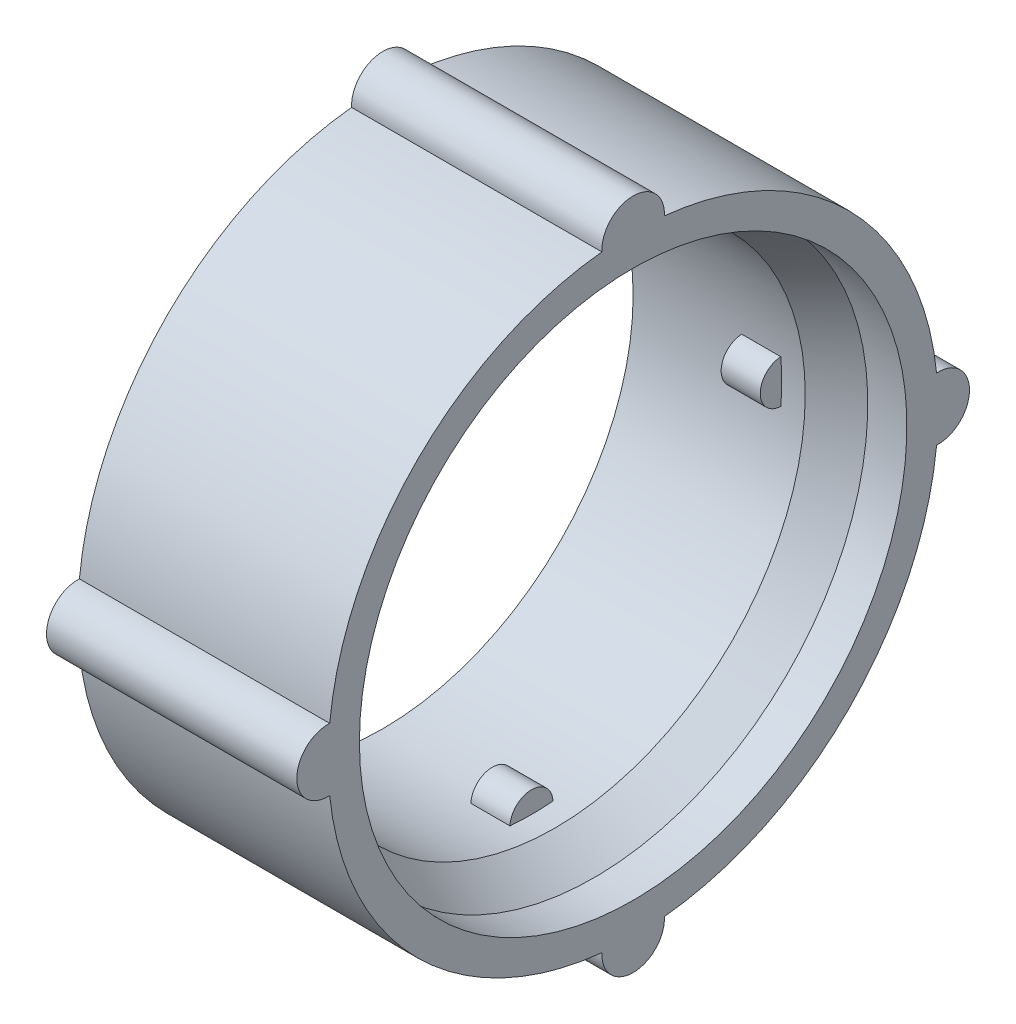
ISO-10303-21;
HEADER;
FILE_DESCRIPTION(('STEP AP214'),'2;1');
FILE_NAME('part.step','',(''),(''),'','','');
FILE_SCHEMA(('AUTOMOTIVE_DESIGN { 1 0 10303 214 1 1 1 1 }'));
ENDSEC;
DATA;
#1=APPLICATION_CONTEXT('core data for automotive mechanical design processes');
#2=APPLICATION_PROTOCOL_DEFINITION('international standard','automotive_design',2000,#1);
#3=PRODUCT_CONTEXT('',#1,'mechanical');
#4=PRODUCT('Part','Part','',(#3));
#5=PRODUCT_RELATED_PRODUCT_CATEGORY('part','',(#4));
#6=PRODUCT_DEFINITION_FORMATION('','',#4);
#7=PRODUCT_DEFINITION_CONTEXT('part definition',#1,'design');
#8=PRODUCT_DEFINITION('design','',#6,#7);
#9=PRODUCT_DEFINITION_SHAPE('','',#8);
#10=(LENGTH_UNIT() NAMED_UNIT(*) SI_UNIT(.MILLI.,.METRE.));
#11=(NAMED_UNIT(*) PLANE_ANGLE_UNIT() SI_UNIT($,.RADIAN.));
#12=(NAMED_UNIT(*) SI_UNIT($,.STERADIAN.) SOLID_ANGLE_UNIT());
#13=UNCERTAINTY_MEASURE_WITH_UNIT(LENGTH_MEASURE(1.E-05),#10,'distance_accuracy_value','');
#14=(GEOMETRIC_REPRESENTATION_CONTEXT(3) GLOBAL_UNCERTAINTY_ASSIGNED_CONTEXT((#13)) GLOBAL_UNIT_ASSIGNED_CONTEXT((#10,
#11,#12)) REPRESENTATION_CONTEXT('',''));
#15=CARTESIAN_POINT('',(0.,0.,0.));
#16=DIRECTION('',(0.,0.,1.));
#17=DIRECTION('',(1.,0.,0.));
#18=AXIS2_PLACEMENT_3D('',#15,#16,#17);
#19=CARTESIAN_POINT('',(0.,0.,0.));
#20=DIRECTION('',(-1.,0.,0.));
#21=DIRECTION('',(0.,0.,1.));
#22=AXIS2_PLACEMENT_3D('',#19,#20,#21);
#23=CYLINDRICAL_SURFACE('',#22,19.5);
#24=CARTESIAN_POINT('',(0.,0.,0.));
#25=DIRECTION('',(-1.,0.,0.));
#26=DIRECTION('',(0.,0.,1.));
#27=AXIS2_PLACEMENT_3D('',#24,#25,#26);
#28=CIRCLE('',#27,19.5);
#29=CARTESIAN_POINT('',(0.,-1.99736841991345,-19.3974358974358));
#30=VERTEX_POINT('',#29);
#31=CARTESIAN_POINT('',(0.,-19.397435897436,-1.99736841991177));
#32=VERTEX_POINT('',#31);
#33=EDGE_CURVE('E48',#30,#32,#28,.T.);
#34=ORIENTED_EDGE('',*,*,#33,.F.);
#35=DIRECTION('',(-1.,0.,0.));
#36=VECTOR('',#35,1.);
#37=CARTESIAN_POINT('',(8.,-1.99736841991345,-19.3974358974358));
#38=LINE('',#37,#36);
#39=CARTESIAN_POINT('',(16.,-1.99736841991345,-19.3974358974358));
#40=VERTEX_POINT('',#39);
#41=EDGE_CURVE('E157',#30,#40,#38,.F.);
#42=ORIENTED_EDGE('',*,*,#41,.T.);
#43=CARTESIAN_POINT('',(16.,0.,0.));
#44=DIRECTION('',(-1.,0.,0.));
#45=DIRECTION('',(0.,0.,1.));
#46=AXIS2_PLACEMENT_3D('',#43,#44,#45);
#47=CIRCLE('',#46,19.5);
#48=CARTESIAN_POINT('',(16.,-19.397435897436,-1.99736841991177));
#49=VERTEX_POINT('',#48);
#50=EDGE_CURVE('E146',#40,#49,#47,.T.);
#51=ORIENTED_EDGE('',*,*,#50,.T.);
#52=DIRECTION('',(-1.,0.,0.));
#53=VECTOR('',#52,1.);
#54=CARTESIAN_POINT('',(8.,-19.397435897436,-1.99736841991177));
#55=LINE('',#54,#53);
#56=EDGE_CURVE('E172',#49,#32,#55,.T.);
#57=ORIENTED_EDGE('',*,*,#56,.T.);
#58=EDGE_LOOP('',(#34,#42,#51,#57));
#59=FACE_BOUND('',#58,.T.);
#60=ADVANCED_FACE('F33',(#59),#23,.T.);
#61=CARTESIAN_POINT('',(0.,-19.3974358974358,1.99736841991396));
#62=VERTEX_POINT('',#61);
#63=CARTESIAN_POINT('',(0.,-1.99736841991229,19.397435897436));
#64=VERTEX_POINT('',#63);
#65=EDGE_CURVE('E330',#62,#64,#28,.T.);
#66=ORIENTED_EDGE('',*,*,#65,.F.);
#67=DIRECTION('',(-1.,0.,0.));
#68=VECTOR('',#67,1.);
#69=CARTESIAN_POINT('',(8.,-19.3974358974358,1.99736841991396));
#70=LINE('',#69,#68);
#71=CARTESIAN_POINT('',(16.,-19.3974358974358,1.99736841991396));
#72=VERTEX_POINT('',#71);
#73=EDGE_CURVE('E174',#62,#72,#70,.F.);
#74=ORIENTED_EDGE('',*,*,#73,.T.);
#75=CARTESIAN_POINT('',(16.,-1.99736841991229,19.397435897436));
#76=VERTEX_POINT('',#75);
#77=EDGE_CURVE('E155',#72,#76,#47,.T.);
#78=ORIENTED_EDGE('',*,*,#77,.T.);
#79=DIRECTION('',(-1.,0.,0.));
#80=VECTOR('',#79,1.);
#81=CARTESIAN_POINT('',(8.,-1.99736841991229,19.397435897436));
#82=LINE('',#81,#80);
#83=EDGE_CURVE('E183',#76,#64,#82,.T.);
#84=ORIENTED_EDGE('',*,*,#83,.T.);
#85=EDGE_LOOP('',(#66,#74,#78,#84));
#86=FACE_BOUND('',#85,.T.);
#87=ADVANCED_FACE('F300',(#86),#23,.T.);
#88=CARTESIAN_POINT('',(0.,1.99736841991339,19.3974358974358));
#89=VERTEX_POINT('',#88);
#90=CARTESIAN_POINT('',(0.,19.3974358974359,1.99736841991287));
#91=VERTEX_POINT('',#90);
#92=EDGE_CURVE('E230',#89,#91,#28,.T.);
#93=ORIENTED_EDGE('',*,*,#92,.F.);
#94=DIRECTION('',(-1.,0.,0.));
#95=VECTOR('',#94,1.);
#96=CARTESIAN_POINT('',(8.,1.99736841991339,19.3974358974358));
#97=LINE('',#96,#95);
#98=CARTESIAN_POINT('',(16.,1.99736841991339,19.3974358974358));
#99=VERTEX_POINT('',#98);
#100=EDGE_CURVE('E186',#89,#99,#97,.F.);
#101=ORIENTED_EDGE('',*,*,#100,.T.);
#102=CARTESIAN_POINT('',(16.,19.3974358974359,1.99736841991287));
#103=VERTEX_POINT('',#102);
#104=EDGE_CURVE('E232',#99,#103,#47,.T.);
#105=ORIENTED_EDGE('',*,*,#104,.T.);
#106=DIRECTION('',(-1.,0.,0.));
#107=VECTOR('',#106,1.);
#108=CARTESIAN_POINT('',(8.,19.3974358974359,1.99736841991287));
#109=LINE('',#108,#107);
#110=EDGE_CURVE('E195',#103,#91,#109,.T.);
#111=ORIENTED_EDGE('',*,*,#110,.T.);
#112=EDGE_LOOP('',(#93,#101,#105,#111));
#113=FACE_BOUND('',#112,.T.);
#114=ADVANCED_FACE('F306',(#113),#23,.T.);
#115=CARTESIAN_POINT('',(0.,0.,0.));
#116=DIRECTION('',(-1.,0.,0.));
#117=DIRECTION('',(0.,0.,1.));
#118=AXIS2_PLACEMENT_3D('',#115,#116,#117);
#119=CYLINDRICAL_SURFACE('',#118,16.);
#120=CARTESIAN_POINT('',(9.5,0.,0.));
#121=DIRECTION('',(-1.,0.,0.));
#122=DIRECTION('',(0.,0.,1.));
#123=AXIS2_PLACEMENT_3D('',#120,#121,#122);
#124=CIRCLE('',#123,16.);
#125=CARTESIAN_POINT('',(9.5,-15.9409179687499,1.37373007304414));
#126=VERTEX_POINT('',#125);
#127=CARTESIAN_POINT('',(9.5,-15.9409179687501,-1.37373007304233));
#128=VERTEX_POINT('',#127);
#129=EDGE_CURVE('E268',#126,#128,#124,.F.);
#130=ORIENTED_EDGE('',*,*,#129,.F.);
#131=DIRECTION('',(-1.,0.,0.));
#132=VECTOR('',#131,1.);
#133=CARTESIAN_POINT('',(8.25,-15.9409179687499,1.37373007304414));
#134=LINE('',#133,#132);
#135=CARTESIAN_POINT('',(7.,-15.9409179687499,1.37373007304414));
#136=VERTEX_POINT('',#135);
#137=EDGE_CURVE('E265',#126,#136,#134,.T.);
#138=ORIENTED_EDGE('',*,*,#137,.T.);
#139=CARTESIAN_POINT('',(7.,0.,0.));
#140=DIRECTION('',(-1.,0.,0.));
#141=DIRECTION('',(0.,0.,1.));
#142=AXIS2_PLACEMENT_3D('',#139,#140,#141);
#143=CIRCLE('',#142,16.);
#144=CARTESIAN_POINT('',(7.,-15.9409179687501,-1.37373007304233));
#145=VERTEX_POINT('',#144);
#146=EDGE_CURVE('E259',#136,#145,#143,.F.);
#147=ORIENTED_EDGE('',*,*,#146,.T.);
#148=DIRECTION('',(-1.,0.,0.));
#149=VECTOR('',#148,1.);
#150=CARTESIAN_POINT('',(8.25,-15.9409179687501,-1.37373007304233));
#151=LINE('',#150,#149);
#152=EDGE_CURVE('E262',#145,#128,#151,.F.);
#153=ORIENTED_EDGE('',*,*,#152,.T.);
#154=EDGE_LOOP('',(#130,#138,#147,#153));
#155=FACE_BOUND('',#154,.T.);
#156=CARTESIAN_POINT('',(9.5,0.,0.));
#157=DIRECTION('',(-1.,0.,0.));
#158=DIRECTION('',(0.,0.,1.));
#159=AXIS2_PLACEMENT_3D('',#156,#157,#158);
#160=CIRCLE('',#159,16.);
#161=CARTESIAN_POINT('',(9.5,15.94091796875,-1.37373007304324));
#162=VERTEX_POINT('',#161);
#163=CARTESIAN_POINT('',(9.5,15.94091796875,1.37373007304324));
#164=VERTEX_POINT('',#163);
#165=EDGE_CURVE('E246',#162,#164,#160,.F.);
#166=ORIENTED_EDGE('',*,*,#165,.F.);
#167=DIRECTION('',(-1.,0.,0.));
#168=VECTOR('',#167,1.);
#169=CARTESIAN_POINT('',(8.25,15.94091796875,-1.37373007304324));
#170=LINE('',#169,#168);
#171=CARTESIAN_POINT('',(7.,15.94091796875,-1.37373007304324));
#172=VERTEX_POINT('',#171);
#173=EDGE_CURVE('E243',#162,#172,#170,.T.);
#174=ORIENTED_EDGE('',*,*,#173,.T.);
#175=CARTESIAN_POINT('',(7.,0.,0.));
#176=DIRECTION('',(-1.,0.,0.));
#177=DIRECTION('',(0.,0.,1.));
#178=AXIS2_PLACEMENT_3D('',#175,#176,#177);
#179=CIRCLE('',#178,16.);
#180=CARTESIAN_POINT('',(7.,15.94091796875,1.37373007304324));
#181=VERTEX_POINT('',#180);
#182=EDGE_CURVE('E237',#172,#181,#179,.F.);
#183=ORIENTED_EDGE('',*,*,#182,.T.);
#184=DIRECTION('',(-1.,0.,0.));
#185=VECTOR('',#184,1.);
#186=CARTESIAN_POINT('',(8.25,15.94091796875,1.37373007304324));
#187=LINE('',#186,#185);
#188=EDGE_CURVE('E240',#181,#164,#187,.F.);
#189=ORIENTED_EDGE('',*,*,#188,.T.);
#190=EDGE_LOOP('',(#166,#174,#183,#189));
#191=FACE_BOUND('',#190,.T.);
#192=CARTESIAN_POINT('',(0.,0.,0.));
#193=DIRECTION('',(-1.,0.,0.));
#194=DIRECTION('',(0.,0.,1.));
#195=AXIS2_PLACEMENT_3D('',#192,#193,#194);
#196=CIRCLE('',#195,16.);
#197=CARTESIAN_POINT('',(0.,0.,16.));
#198=VERTEX_POINT('',#197);
#199=EDGE_CURVE('E234',#198,#198,#196,.T.);
#200=ORIENTED_EDGE('',*,*,#199,.T.);
#201=EDGE_LOOP('',(#200));
#202=FACE_BOUND('',#201,.T.);
#203=CARTESIAN_POINT('',(11.,0.,0.));
#204=DIRECTION('',(-1.,0.,0.));
#205=DIRECTION('',(0.,0.,1.));
#206=AXIS2_PLACEMENT_3D('',#203,#204,#205);
#207=CIRCLE('',#206,16.);
#208=CARTESIAN_POINT('',(11.,0.,16.));
#209=VERTEX_POINT('',#208);
#210=EDGE_CURVE('E220',#209,#209,#207,.T.);
#211=ORIENTED_EDGE('',*,*,#210,.F.);
#212=EDGE_LOOP('',(#211));
#213=FACE_BOUND('',#212,.T.);
#214=CARTESIAN_POINT('',(9.5,0.,0.));
#215=DIRECTION('',(-1.,0.,0.));
#216=DIRECTION('',(0.,0.,1.));
#217=AXIS2_PLACEMENT_3D('',#214,#215,#216);
#218=CIRCLE('',#217,16.);
#219=CARTESIAN_POINT('',(9.5,1.37373007304367,15.94091796875));
#220=VERTEX_POINT('',#219);
#221=CARTESIAN_POINT('',(9.5,-1.37373007304277,15.94091796875));
#222=VERTEX_POINT('',#221);
#223=EDGE_CURVE('E257',#220,#222,#218,.F.);
#224=ORIENTED_EDGE('',*,*,#223,.F.);
#225=DIRECTION('',(-1.,0.,0.));
#226=VECTOR('',#225,1.);
#227=CARTESIAN_POINT('',(8.25,1.37373007304367,15.94091796875));
#228=LINE('',#227,#226);
#229=CARTESIAN_POINT('',(7.,1.37373007304367,15.94091796875));
#230=VERTEX_POINT('',#229);
#231=EDGE_CURVE('E254',#220,#230,#228,.T.);
#232=ORIENTED_EDGE('',*,*,#231,.T.);
#233=CARTESIAN_POINT('',(7.,0.,0.));
#234=DIRECTION('',(-1.,0.,0.));
#235=DIRECTION('',(0.,0.,1.));
#236=AXIS2_PLACEMENT_3D('',#233,#234,#235);
#237=CIRCLE('',#236,16.);
#238=CARTESIAN_POINT('',(7.,-1.37373007304277,15.94091796875));
#239=VERTEX_POINT('',#238);
#240=EDGE_CURVE('E248',#230,#239,#237,.F.);
#241=ORIENTED_EDGE('',*,*,#240,.T.);
#242=DIRECTION('',(-1.,0.,0.));
#243=VECTOR('',#242,1.);
#244=CARTESIAN_POINT('',(8.25,-1.37373007304277,15.94091796875));
#245=LINE('',#244,#243);
#246=EDGE_CURVE('E251',#239,#222,#245,.F.);
#247=ORIENTED_EDGE('',*,*,#246,.T.);
#248=EDGE_LOOP('',(#224,#232,#241,#247));
#249=FACE_BOUND('',#248,.T.);
#250=CARTESIAN_POINT('',(9.5,0.,0.));
#251=DIRECTION('',(-1.,0.,0.));
#252=DIRECTION('',(0.,0.,1.));
#253=AXIS2_PLACEMENT_3D('',#250,#251,#252);
#254=CIRCLE('',#253,16.);
#255=CARTESIAN_POINT('',(9.5,-1.37373007304371,-15.94091796875));
#256=VERTEX_POINT('',#255);
#257=CARTESIAN_POINT('',(9.5,1.3737300730428,-15.94091796875));
#258=VERTEX_POINT('',#257);
#259=EDGE_CURVE('E11',#256,#258,#254,.F.);
#260=ORIENTED_EDGE('',*,*,#259,.F.);
#261=DIRECTION('',(-1.,0.,0.));
#262=VECTOR('',#261,1.);
#263=CARTESIAN_POINT('',(8.25,-1.37373007304371,-15.94091796875));
#264=LINE('',#263,#262);
#265=CARTESIAN_POINT('',(7.,-1.37373007304371,-15.94091796875));
#266=VERTEX_POINT('',#265);
#267=EDGE_CURVE('E41',#256,#266,#264,.T.);
#268=ORIENTED_EDGE('',*,*,#267,.T.);
#269=CARTESIAN_POINT('',(7.,0.,0.));
#270=DIRECTION('',(-1.,0.,0.));
#271=DIRECTION('',(0.,0.,1.));
#272=AXIS2_PLACEMENT_3D('',#269,#270,#271);
#273=CIRCLE('',#272,16.);
#274=CARTESIAN_POINT('',(7.,1.3737300730428,-15.94091796875));
#275=VERTEX_POINT('',#274);
#276=EDGE_CURVE('E270',#266,#275,#273,.F.);
#277=ORIENTED_EDGE('',*,*,#276,.T.);
#278=DIRECTION('',(-1.,0.,0.));
#279=VECTOR('',#278,1.);
#280=CARTESIAN_POINT('',(8.25,1.3737300730428,-15.94091796875));
#281=LINE('',#280,#279);
#282=EDGE_CURVE('E273',#275,#258,#281,.F.);
#283=ORIENTED_EDGE('',*,*,#282,.T.);
#284=EDGE_LOOP('',(#260,#268,#277,#283));
#285=FACE_BOUND('',#284,.T.);
#286=ADVANCED_FACE('F278',(#155,#191,#202,#213,#249,#285),#119,.F.);
#287=CARTESIAN_POINT('',(16.,0.,-19.5));
#288=DIRECTION('',(-1.,0.,0.));
#289=DIRECTION('',(0.,0.,1.));
#290=AXIS2_PLACEMENT_3D('',#287,#288,#289);
#291=PLANE('',#290);
#292=CARTESIAN_POINT('',(16.,-5.54223333892878E-13,-19.4999999999994));
#293=DIRECTION('',(-1.,0.,0.));
#294=DIRECTION('',(0.,0.,1.));
#295=AXIS2_PLACEMENT_3D('',#292,#293,#294);
#296=CIRCLE('',#295,2.);
#297=CARTESIAN_POINT('',(16.,1.99736841991235,-19.397435897436));
#298=VERTEX_POINT('',#297);
#299=EDGE_CURVE('E150',#40,#298,#296,.F.);
#300=ORIENTED_EDGE('',*,*,#299,.T.);
#301=CARTESIAN_POINT('',(16.,19.3974358974359,-1.99736841991287));
#302=VERTEX_POINT('',#301);
#303=EDGE_CURVE('E154',#302,#298,#47,.T.);
#304=ORIENTED_EDGE('',*,*,#303,.F.);
#305=CARTESIAN_POINT('',(16.,19.5,0.));
#306=DIRECTION('',(-1.,0.,0.));
#307=DIRECTION('',(0.,0.,1.));
#308=AXIS2_PLACEMENT_3D('',#305,#306,#307);
#309=CIRCLE('',#308,2.);
#310=EDGE_CURVE('E192',#302,#103,#309,.F.);
#311=ORIENTED_EDGE('',*,*,#310,.T.);
#312=ORIENTED_EDGE('',*,*,#104,.F.);
#313=CARTESIAN_POINT('',(16.,5.51835272634541E-13,19.5000000000005));
#314=DIRECTION('',(-1.,0.,0.));
#315=DIRECTION('',(0.,0.,1.));
#316=AXIS2_PLACEMENT_3D('',#313,#314,#315);
#317=CIRCLE('',#316,2.);
#318=EDGE_CURVE('E180',#99,#76,#317,.F.);
#319=ORIENTED_EDGE('',*,*,#318,.T.);
#320=ORIENTED_EDGE('',*,*,#77,.F.);
#321=CARTESIAN_POINT('',(16.,-19.5,1.10367054526908E-12));
#322=DIRECTION('',(-1.,0.,0.));
#323=DIRECTION('',(0.,0.,1.));
#324=AXIS2_PLACEMENT_3D('',#321,#322,#323);
#325=CIRCLE('',#324,2.);
#326=EDGE_CURVE('E152',#72,#49,#325,.F.);
#327=ORIENTED_EDGE('',*,*,#326,.T.);
#328=ORIENTED_EDGE('',*,*,#50,.F.);
#329=EDGE_LOOP('',(#300,#304,#311,#312,#319,#320,#327,#328));
#330=FACE_BOUND('',#329,.T.);
#331=CARTESIAN_POINT('',(16.,0.,0.));
#332=DIRECTION('',(-1.,0.,0.));
#333=DIRECTION('',(0.,0.,1.));
#334=AXIS2_PLACEMENT_3D('',#331,#332,#333);
#335=CIRCLE('',#334,17.5);
#336=CARTESIAN_POINT('',(16.,0.,17.5));
#337=VERTEX_POINT('',#336);
#338=EDGE_CURVE('E227',#337,#337,#335,.T.);
#339=ORIENTED_EDGE('',*,*,#338,.T.);
#340=EDGE_LOOP('',(#339));
#341=FACE_BOUND('',#340,.T.);
#342=ADVANCED_FACE('F147',(#330,#341),#291,.F.);
#343=CARTESIAN_POINT('',(0.,0.,-19.5));
#344=DIRECTION('',(1.,0.,0.));
#345=DIRECTION('',(0.,0.,-1.));
#346=AXIS2_PLACEMENT_3D('',#343,#344,#345);
#347=PLANE('',#346);
#348=ORIENTED_EDGE('',*,*,#199,.F.);
#349=EDGE_LOOP('',(#348));
#350=FACE_BOUND('',#349,.T.);
#351=CARTESIAN_POINT('',(0.,19.3974358974359,-1.99736841991287));
#352=VERTEX_POINT('',#351);
#353=CARTESIAN_POINT('',(0.,1.99736841991235,-19.397435897436));
#354=VERTEX_POINT('',#353);
#355=EDGE_CURVE('E231',#352,#354,#28,.T.);
#356=ORIENTED_EDGE('',*,*,#355,.T.);
#357=CARTESIAN_POINT('',(0.,-5.54223333892878E-13,-19.4999999999994));
#358=DIRECTION('',(-1.,0.,0.));
#359=DIRECTION('',(0.,0.,1.));
#360=AXIS2_PLACEMENT_3D('',#357,#358,#359);
#361=CIRCLE('',#360,2.);
#362=EDGE_CURVE('E164',#354,#30,#361,.T.);
#363=ORIENTED_EDGE('',*,*,#362,.T.);
#364=ORIENTED_EDGE('',*,*,#33,.T.);
#365=CARTESIAN_POINT('',(0.,-19.5,1.10367054526908E-12));
#366=DIRECTION('',(-1.,0.,0.));
#367=DIRECTION('',(0.,0.,1.));
#368=AXIS2_PLACEMENT_3D('',#365,#366,#367);
#369=CIRCLE('',#368,2.);
#370=EDGE_CURVE('E161',#32,#62,#369,.T.);
#371=ORIENTED_EDGE('',*,*,#370,.T.);
#372=ORIENTED_EDGE('',*,*,#65,.T.);
#373=CARTESIAN_POINT('',(0.,5.51835272634541E-13,19.5000000000005));
#374=DIRECTION('',(-1.,0.,0.));
#375=DIRECTION('',(0.,0.,1.));
#376=AXIS2_PLACEMENT_3D('',#373,#374,#375);
#377=CIRCLE('',#376,2.);
#378=EDGE_CURVE('E177',#64,#89,#377,.T.);
#379=ORIENTED_EDGE('',*,*,#378,.T.);
#380=ORIENTED_EDGE('',*,*,#92,.T.);
#381=CARTESIAN_POINT('',(0.,19.5,0.));
#382=DIRECTION('',(-1.,0.,0.));
#383=DIRECTION('',(0.,0.,1.));
#384=AXIS2_PLACEMENT_3D('',#381,#382,#383);
#385=CIRCLE('',#384,2.);
#386=EDGE_CURVE('E189',#91,#352,#385,.T.);
#387=ORIENTED_EDGE('',*,*,#386,.T.);
#388=EDGE_LOOP('',(#356,#363,#364,#371,#372,#379,#380,#387));
#389=FACE_BOUND('',#388,.T.);
#390=ADVANCED_FACE('F35',(#350,#389),#347,.F.);
#391=ORIENTED_EDGE('',*,*,#303,.T.);
#392=DIRECTION('',(-1.,0.,0.));
#393=VECTOR('',#392,1.);
#394=CARTESIAN_POINT('',(8.,1.99736841991235,-19.397435897436));
#395=LINE('',#394,#393);
#396=EDGE_CURVE('E56',#298,#354,#395,.T.);
#397=ORIENTED_EDGE('',*,*,#396,.T.);
#398=ORIENTED_EDGE('',*,*,#355,.F.);
#399=DIRECTION('',(-1.,0.,0.));
#400=VECTOR('',#399,1.);
#401=CARTESIAN_POINT('',(8.,19.3974358974359,-1.99736841991287));
#402=LINE('',#401,#400);
#403=EDGE_CURVE('E198',#352,#302,#402,.F.);
#404=ORIENTED_EDGE('',*,*,#403,.T.);
#405=EDGE_LOOP('',(#391,#397,#398,#404));
#406=FACE_BOUND('',#405,.T.);
#407=ADVANCED_FACE('F302',(#406),#23,.T.);
#408=CARTESIAN_POINT('',(0.,0.,0.));
#409=DIRECTION('',(-1.,0.,0.));
#410=DIRECTION('',(0.,0.,1.));
#411=AXIS2_PLACEMENT_3D('',#408,#409,#410);
#412=CYLINDRICAL_SURFACE('',#411,17.5);
#413=CARTESIAN_POINT('',(13.5,0.,0.));
#414=DIRECTION('',(-1.,0.,0.));
#415=DIRECTION('',(0.,0.,1.));
#416=AXIS2_PLACEMENT_3D('',#413,#414,#415);
#417=CIRCLE('',#416,17.5);
#418=CARTESIAN_POINT('',(13.5,0.,17.5));
#419=VERTEX_POINT('',#418);
#420=EDGE_CURVE('E224',#419,#419,#417,.T.);
#421=ORIENTED_EDGE('',*,*,#420,.T.);
#422=EDGE_LOOP('',(#421));
#423=FACE_BOUND('',#422,.T.);
#424=ORIENTED_EDGE('',*,*,#338,.F.);
#425=EDGE_LOOP('',(#424));
#426=FACE_BOUND('',#425,.T.);
#427=ADVANCED_FACE('F311',(#423,#426),#412,.F.);
#428=CARTESIAN_POINT('',(13.5,0.,0.));
#429=DIRECTION('',(1.,0.,0.));
#430=DIRECTION('',(0.,0.,-1.));
#431=AXIS2_PLACEMENT_3D('',#428,#429,#430);
#432=CONICAL_SURFACE('',#431,17.5,0.540419500270586);
#433=ORIENTED_EDGE('',*,*,#210,.T.);
#434=EDGE_LOOP('',(#433));
#435=FACE_BOUND('',#434,.T.);
#436=ORIENTED_EDGE('',*,*,#420,.F.);
#437=EDGE_LOOP('',(#436));
#438=FACE_BOUND('',#437,.T.);
#439=ADVANCED_FACE('F316',(#435,#438),#432,.F.);
#440=CARTESIAN_POINT('',(9.5,16.,0.));
#441=DIRECTION('',(-1.,0.,0.));
#442=DIRECTION('',(0.,0.,1.));
#443=AXIS2_PLACEMENT_3D('',#440,#441,#442);
#444=CYLINDRICAL_SURFACE('',#443,1.375);
#445=ORIENTED_EDGE('',*,*,#173,.F.);
#446=CARTESIAN_POINT('',(9.5,16.,0.));
#447=DIRECTION('',(-1.,0.,0.));
#448=DIRECTION('',(0.,0.,1.));
#449=AXIS2_PLACEMENT_3D('',#446,#447,#448);
#450=CIRCLE('',#449,1.375);
#451=EDGE_CURVE('E217',#162,#164,#450,.T.);
#452=ORIENTED_EDGE('',*,*,#451,.T.);
#453=ORIENTED_EDGE('',*,*,#188,.F.);
#454=CARTESIAN_POINT('',(7.,16.,0.));
#455=DIRECTION('',(-1.,0.,0.));
#456=DIRECTION('',(0.,0.,1.));
#457=AXIS2_PLACEMENT_3D('',#454,#455,#456);
#458=CIRCLE('',#457,1.375);
#459=EDGE_CURVE('E215',#172,#181,#458,.T.);
#460=ORIENTED_EDGE('',*,*,#459,.F.);
#461=EDGE_LOOP('',(#445,#452,#453,#460));
#462=FACE_BOUND('',#461,.T.);
#463=ADVANCED_FACE('F405',(#462),#444,.T.);
#464=CARTESIAN_POINT('',(9.5,16.,0.));
#465=DIRECTION('',(-1.,0.,0.));
#466=DIRECTION('',(0.,0.,1.));
#467=AXIS2_PLACEMENT_3D('',#464,#465,#466);
#468=PLANE('',#467);
#469=ORIENTED_EDGE('',*,*,#451,.F.);
#470=ORIENTED_EDGE('',*,*,#165,.T.);
#471=EDGE_LOOP('',(#469,#470));
#472=FACE_BOUND('',#471,.T.);
#473=ADVANCED_FACE('F416',(#472),#468,.F.);
#474=CARTESIAN_POINT('',(7.,16.,0.));
#475=DIRECTION('',(-1.,0.,0.));
#476=DIRECTION('',(0.,0.,1.));
#477=AXIS2_PLACEMENT_3D('',#474,#475,#476);
#478=PLANE('',#477);
#479=ORIENTED_EDGE('',*,*,#182,.F.);
#480=ORIENTED_EDGE('',*,*,#459,.T.);
#481=EDGE_LOOP('',(#479,#480));
#482=FACE_BOUND('',#481,.T.);
#483=ADVANCED_FACE('F425',(#482),#478,.T.);
#484=CARTESIAN_POINT('',(9.5,4.52787916007828E-13,16.0000000000005));
#485=DIRECTION('',(-1.,0.,0.));
#486=DIRECTION('',(0.,0.,1.));
#487=AXIS2_PLACEMENT_3D('',#484,#485,#486);
#488=CYLINDRICAL_SURFACE('',#487,1.375);
#489=ORIENTED_EDGE('',*,*,#231,.F.);
#490=CARTESIAN_POINT('',(9.5,4.52787916007828E-13,16.0000000000005));
#491=DIRECTION('',(-1.,0.,0.));
#492=DIRECTION('',(0.,0.,1.));
#493=AXIS2_PLACEMENT_3D('',#490,#491,#492);
#494=CIRCLE('',#493,1.375);
#495=EDGE_CURVE('E212',#220,#222,#494,.T.);
#496=ORIENTED_EDGE('',*,*,#495,.T.);
#497=ORIENTED_EDGE('',*,*,#246,.F.);
#498=CARTESIAN_POINT('',(7.,4.52787916007828E-13,16.0000000000005));
#499=DIRECTION('',(-1.,0.,0.));
#500=DIRECTION('',(0.,0.,1.));
#501=AXIS2_PLACEMENT_3D('',#498,#499,#500);
#502=CIRCLE('',#501,1.375);
#503=EDGE_CURVE('E210',#230,#239,#502,.T.);
#504=ORIENTED_EDGE('',*,*,#503,.F.);
#505=EDGE_LOOP('',(#489,#496,#497,#504));
#506=FACE_BOUND('',#505,.T.);
#507=ADVANCED_FACE('F433',(#506),#488,.T.);
#508=CARTESIAN_POINT('',(9.5,4.52787916007828E-13,16.0000000000005));
#509=DIRECTION('',(-1.,0.,0.));
#510=DIRECTION('',(0.,0.,1.));
#511=AXIS2_PLACEMENT_3D('',#508,#509,#510);
#512=PLANE('',#511);
#513=ORIENTED_EDGE('',*,*,#495,.F.);
#514=ORIENTED_EDGE('',*,*,#223,.T.);
#515=EDGE_LOOP('',(#513,#514));
#516=FACE_BOUND('',#515,.T.);
#517=ADVANCED_FACE('F441',(#516),#512,.F.);
#518=CARTESIAN_POINT('',(7.,4.52787916007828E-13,16.0000000000005));
#519=DIRECTION('',(-1.,0.,0.));
#520=DIRECTION('',(0.,0.,1.));
#521=AXIS2_PLACEMENT_3D('',#518,#519,#520);
#522=PLANE('',#521);
#523=ORIENTED_EDGE('',*,*,#240,.F.);
#524=ORIENTED_EDGE('',*,*,#503,.T.);
#525=EDGE_LOOP('',(#523,#524));
#526=FACE_BOUND('',#525,.T.);
#527=ADVANCED_FACE('F449',(#526),#522,.T.);
#528=CARTESIAN_POINT('',(9.5,-16.,9.05575832015657E-13));
#529=DIRECTION('',(-1.,0.,0.));
#530=DIRECTION('',(0.,0.,1.));
#531=AXIS2_PLACEMENT_3D('',#528,#529,#530);
#532=CYLINDRICAL_SURFACE('',#531,1.375);
#533=ORIENTED_EDGE('',*,*,#137,.F.);
#534=CARTESIAN_POINT('',(9.5,-16.,9.05575832015657E-13));
#535=DIRECTION('',(-1.,0.,0.));
#536=DIRECTION('',(0.,0.,1.));
#537=AXIS2_PLACEMENT_3D('',#534,#535,#536);
#538=CIRCLE('',#537,1.375);
#539=EDGE_CURVE('E207',#126,#128,#538,.T.);
#540=ORIENTED_EDGE('',*,*,#539,.T.);
#541=ORIENTED_EDGE('',*,*,#152,.F.);
#542=CARTESIAN_POINT('',(7.,-16.,9.05575832015657E-13));
#543=DIRECTION('',(-1.,0.,0.));
#544=DIRECTION('',(0.,0.,1.));
#545=AXIS2_PLACEMENT_3D('',#542,#543,#544);
#546=CIRCLE('',#545,1.375);
#547=EDGE_CURVE('E205',#136,#145,#546,.T.);
#548=ORIENTED_EDGE('',*,*,#547,.F.);
#549=EDGE_LOOP('',(#533,#540,#541,#548));
#550=FACE_BOUND('',#549,.T.);
#551=ADVANCED_FACE('F457',(#550),#532,.T.);
#552=CARTESIAN_POINT('',(9.5,-16.,9.05575832015657E-13));
#553=DIRECTION('',(-1.,0.,0.));
#554=DIRECTION('',(0.,0.,1.));
#555=AXIS2_PLACEMENT_3D('',#552,#553,#554);
#556=PLANE('',#555);
#557=ORIENTED_EDGE('',*,*,#539,.F.);
#558=ORIENTED_EDGE('',*,*,#129,.T.);
#559=EDGE_LOOP('',(#557,#558));
#560=FACE_BOUND('',#559,.T.);
#561=ADVANCED_FACE('F465',(#560),#556,.F.);
#562=CARTESIAN_POINT('',(7.,-16.,9.05575832015657E-13));
#563=DIRECTION('',(-1.,0.,0.));
#564=DIRECTION('',(0.,0.,1.));
#565=AXIS2_PLACEMENT_3D('',#562,#563,#564);
#566=PLANE('',#565);
#567=ORIENTED_EDGE('',*,*,#146,.F.);
#568=ORIENTED_EDGE('',*,*,#547,.T.);
#569=EDGE_LOOP('',(#567,#568));
#570=FACE_BOUND('',#569,.T.);
#571=ADVANCED_FACE('F296',(#570),#566,.T.);
#572=CARTESIAN_POINT('',(9.5,-4.54747350886464E-13,-15.9999999999995));
#573=DIRECTION('',(-1.,0.,0.));
#574=DIRECTION('',(0.,0.,1.));
#575=AXIS2_PLACEMENT_3D('',#572,#573,#574);
#576=CYLINDRICAL_SURFACE('',#575,1.375);
#577=ORIENTED_EDGE('',*,*,#267,.F.);
#578=CARTESIAN_POINT('',(9.5,-4.54747350886464E-13,-15.9999999999995));
#579=DIRECTION('',(-1.,0.,0.));
#580=DIRECTION('',(0.,0.,1.));
#581=AXIS2_PLACEMENT_3D('',#578,#579,#580);
#582=CIRCLE('',#581,1.375);
#583=EDGE_CURVE('E202',#256,#258,#582,.T.);
#584=ORIENTED_EDGE('',*,*,#583,.T.);
#585=ORIENTED_EDGE('',*,*,#282,.F.);
#586=CARTESIAN_POINT('',(7.,-4.54747350886464E-13,-15.9999999999995));
#587=DIRECTION('',(-1.,0.,0.));
#588=DIRECTION('',(0.,0.,1.));
#589=AXIS2_PLACEMENT_3D('',#586,#587,#588);
#590=CIRCLE('',#589,1.375);
#591=EDGE_CURVE('E201',#266,#275,#590,.T.);
#592=ORIENTED_EDGE('',*,*,#591,.F.);
#593=EDGE_LOOP('',(#577,#584,#585,#592));
#594=FACE_BOUND('',#593,.T.);
#595=ADVANCED_FACE('F282',(#594),#576,.T.);
#596=CARTESIAN_POINT('',(9.5,-4.54747350886464E-13,-15.9999999999995));
#597=DIRECTION('',(-1.,0.,0.));
#598=DIRECTION('',(0.,0.,1.));
#599=AXIS2_PLACEMENT_3D('',#596,#597,#598);
#600=PLANE('',#599);
#601=ORIENTED_EDGE('',*,*,#583,.F.);
#602=ORIENTED_EDGE('',*,*,#259,.T.);
#603=EDGE_LOOP('',(#601,#602));
#604=FACE_BOUND('',#603,.T.);
#605=ADVANCED_FACE('F285',(#604),#600,.F.);
#606=CARTESIAN_POINT('',(7.,-4.54747350886464E-13,-15.9999999999995));
#607=DIRECTION('',(-1.,0.,0.));
#608=DIRECTION('',(0.,0.,1.));
#609=AXIS2_PLACEMENT_3D('',#606,#607,#608);
#610=PLANE('',#609);
#611=ORIENTED_EDGE('',*,*,#276,.F.);
#612=ORIENTED_EDGE('',*,*,#591,.T.);
#613=EDGE_LOOP('',(#611,#612));
#614=FACE_BOUND('',#613,.T.);
#615=ADVANCED_FACE('F287',(#614),#610,.T.);
#616=CARTESIAN_POINT('',(21.6568542494924,19.5,0.));
#617=DIRECTION('',(-1.,0.,0.));
#618=DIRECTION('',(0.,0.,1.));
#619=AXIS2_PLACEMENT_3D('',#616,#617,#618);
#620=CYLINDRICAL_SURFACE('',#619,2.);
#621=ORIENTED_EDGE('',*,*,#403,.F.);
#622=ORIENTED_EDGE('',*,*,#386,.F.);
#623=ORIENTED_EDGE('',*,*,#110,.F.);
#624=ORIENTED_EDGE('',*,*,#310,.F.);
#625=EDGE_LOOP('',(#621,#622,#623,#624));
#626=FACE_BOUND('',#625,.T.);
#627=ADVANCED_FACE('F293',(#626),#620,.T.);
#628=CARTESIAN_POINT('',(21.6568542494924,5.51835272634541E-13,19.5000000000005));
#629=DIRECTION('',(-1.,0.,0.));
#630=DIRECTION('',(0.,0.,1.));
#631=AXIS2_PLACEMENT_3D('',#628,#629,#630);
#632=CYLINDRICAL_SURFACE('',#631,2.);
#633=ORIENTED_EDGE('',*,*,#100,.F.);
#634=ORIENTED_EDGE('',*,*,#378,.F.);
#635=ORIENTED_EDGE('',*,*,#83,.F.);
#636=ORIENTED_EDGE('',*,*,#318,.F.);
#637=EDGE_LOOP('',(#633,#634,#635,#636));
#638=FACE_BOUND('',#637,.T.);
#639=ADVANCED_FACE('F333',(#638),#632,.T.);
#640=CARTESIAN_POINT('',(21.6568542494924,-19.5,1.10367054526908E-12));
#641=DIRECTION('',(-1.,0.,0.));
#642=DIRECTION('',(0.,0.,1.));
#643=AXIS2_PLACEMENT_3D('',#640,#641,#642);
#644=CYLINDRICAL_SURFACE('',#643,2.);
#645=ORIENTED_EDGE('',*,*,#73,.F.);
#646=ORIENTED_EDGE('',*,*,#370,.F.);
#647=ORIENTED_EDGE('',*,*,#56,.F.);
#648=ORIENTED_EDGE('',*,*,#326,.F.);
#649=EDGE_LOOP('',(#645,#646,#647,#648));
#650=FACE_BOUND('',#649,.T.);
#651=ADVANCED_FACE('F341',(#650),#644,.T.);
#652=CARTESIAN_POINT('',(21.6568542494924,-5.54223333892878E-13,-19.4999999999994));
#653=DIRECTION('',(-1.,0.,0.));
#654=DIRECTION('',(0.,0.,1.));
#655=AXIS2_PLACEMENT_3D('',#652,#653,#654);
#656=CYLINDRICAL_SURFACE('',#655,2.);
#657=ORIENTED_EDGE('',*,*,#41,.F.);
#658=ORIENTED_EDGE('',*,*,#362,.F.);
#659=ORIENTED_EDGE('',*,*,#396,.F.);
#660=ORIENTED_EDGE('',*,*,#299,.F.);
#661=EDGE_LOOP('',(#657,#658,#659,#660));
#662=FACE_BOUND('',#661,.T.);
#663=ADVANCED_FACE('F163',(#662),#656,.T.);
#664=CLOSED_SHELL('',(#60,#87,#114,#286,#342,#390,#407,#427,#439,#463,#473,#483,#507,#517,#527,
#551,#561,#571,#595,#605,#615,#627,#639,#651,#663));
#665=MANIFOLD_SOLID_BREP('B2',#664);
#666=ADVANCED_BREP_SHAPE_REPRESENTATION('',(#18,#665),#14);
#667=SHAPE_DEFINITION_REPRESENTATION(#9,#666);
ENDSEC;
END-ISO-10303-21;
